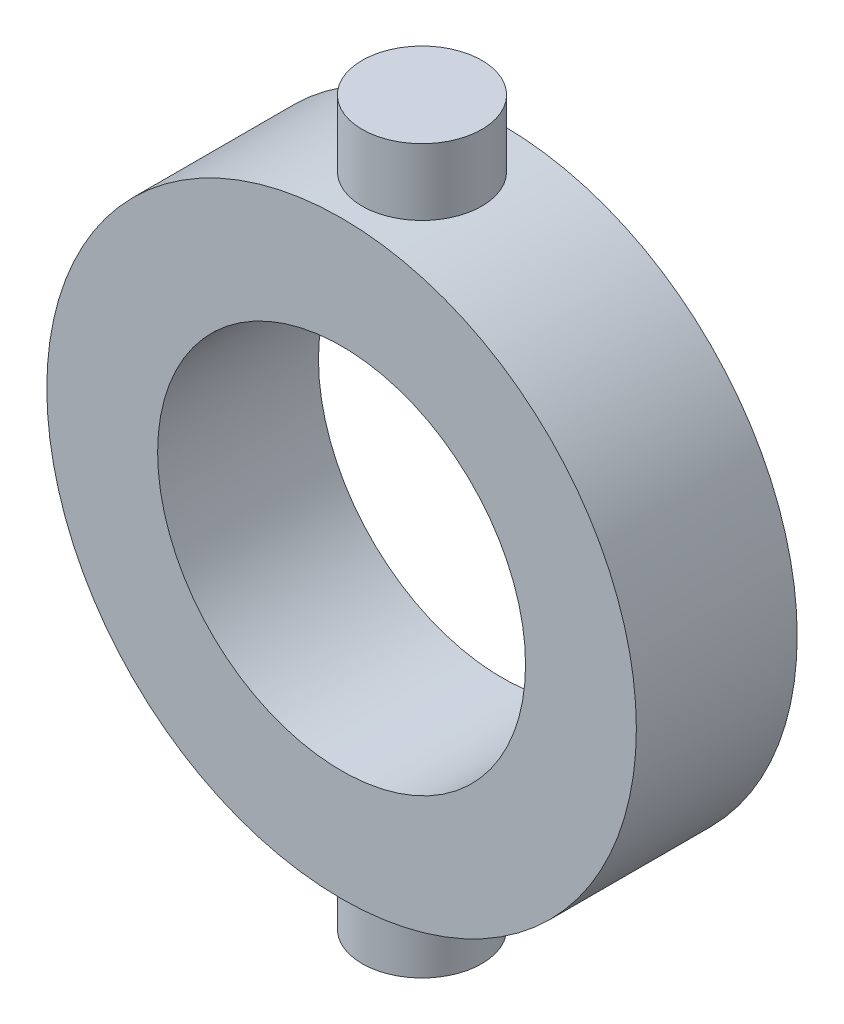
ISO-10303-21;
HEADER;
FILE_DESCRIPTION(('STEP AP214'),'2;1');
FILE_NAME('part.step','',(''),(''),'','','');
FILE_SCHEMA(('AUTOMOTIVE_DESIGN { 1 0 10303 214 1 1 1 1 }'));
ENDSEC;
DATA;
#1=APPLICATION_CONTEXT('core data for automotive mechanical design processes');
#2=APPLICATION_PROTOCOL_DEFINITION('international standard','automotive_design',2000,#1);
#3=PRODUCT_CONTEXT('',#1,'mechanical');
#4=PRODUCT('Part','Part','',(#3));
#5=PRODUCT_RELATED_PRODUCT_CATEGORY('part','',(#4));
#6=PRODUCT_DEFINITION_FORMATION('','',#4);
#7=PRODUCT_DEFINITION_CONTEXT('part definition',#1,'design');
#8=PRODUCT_DEFINITION('design','',#6,#7);
#9=PRODUCT_DEFINITION_SHAPE('','',#8);
#10=(LENGTH_UNIT() NAMED_UNIT(*) SI_UNIT(.MILLI.,.METRE.));
#11=(NAMED_UNIT(*) PLANE_ANGLE_UNIT() SI_UNIT($,.RADIAN.));
#12=(NAMED_UNIT(*) SI_UNIT($,.STERADIAN.) SOLID_ANGLE_UNIT());
#13=UNCERTAINTY_MEASURE_WITH_UNIT(LENGTH_MEASURE(1.E-05),#10,'distance_accuracy_value','');
#14=(GEOMETRIC_REPRESENTATION_CONTEXT(3) GLOBAL_UNCERTAINTY_ASSIGNED_CONTEXT((#13)) GLOBAL_UNIT_ASSIGNED_CONTEXT((#10,
#11,#12)) REPRESENTATION_CONTEXT('',''));
#15=CARTESIAN_POINT('',(0.,0.,0.));
#16=DIRECTION('',(0.,0.,1.));
#17=DIRECTION('',(1.,0.,0.));
#18=AXIS2_PLACEMENT_3D('',#15,#16,#17);
#19=CARTESIAN_POINT('',(0.,-81.5,0.));
#20=DIRECTION('',(0.,1.,0.));
#21=DIRECTION('',(0.,0.,1.));
#22=AXIS2_PLACEMENT_3D('',#19,#20,#21);
#23=CYLINDRICAL_SURFACE('',#22,13.5);
#24=CARTESIAN_POINT('',(0.,-81.5,0.));
#25=DIRECTION('',(0.,1.,0.));
#26=DIRECTION('',(0.,0.,1.));
#27=AXIS2_PLACEMENT_3D('',#24,#25,#26);
#28=CIRCLE('',#27,13.5);
#29=CARTESIAN_POINT('',(0.,-81.5,13.5));
#30=VERTEX_POINT('',#29);
#31=EDGE_CURVE('E11',#30,#30,#28,.T.);
#32=ORIENTED_EDGE('',*,*,#31,.T.);
#33=EDGE_LOOP('',(#32));
#34=FACE_BOUND('',#33,.T.);
#35=CARTESIAN_POINT('',(0.,-66.5,0.));
#36=DIRECTION('',(0.,1.,0.));
#37=DIRECTION('',(0.,0.,1.));
#38=AXIS2_PLACEMENT_3D('',#35,#36,#37);
#39=CIRCLE('',#38,13.5);
#40=CARTESIAN_POINT('',(0.,-66.5,13.5));
#41=VERTEX_POINT('',#40);
#42=EDGE_CURVE('E54',#41,#41,#39,.T.);
#43=ORIENTED_EDGE('',*,*,#42,.F.);
#44=EDGE_LOOP('',(#43));
#45=FACE_BOUND('',#44,.T.);
#46=ADVANCED_FACE('F51',(#34,#45),#23,.T.);
#47=CARTESIAN_POINT('',(0.,-81.5,0.));
#48=DIRECTION('',(0.,1.,0.));
#49=DIRECTION('',(0.,0.,1.));
#50=AXIS2_PLACEMENT_3D('',#47,#48,#49);
#51=PLANE('',#50);
#52=ORIENTED_EDGE('',*,*,#31,.F.);
#53=EDGE_LOOP('',(#52));
#54=FACE_BOUND('',#53,.T.);
#55=ADVANCED_FACE('F66',(#54),#51,.F.);
#56=CARTESIAN_POINT('',(0.,-66.5,0.));
#57=DIRECTION('',(0.,1.,0.));
#58=DIRECTION('',(0.,0.,1.));
#59=AXIS2_PLACEMENT_3D('',#56,#57,#58);
#60=PLANE('',#59);
#61=ORIENTED_EDGE('',*,*,#42,.T.);
#62=EDGE_LOOP('',(#61));
#63=FACE_BOUND('',#62,.T.);
#64=ADVANCED_FACE('F63',(#63),#60,.T.);
#65=CLOSED_SHELL('',(#46,#55,#64));
#66=MANIFOLD_SOLID_BREP('B2',#65);
#67=CARTESIAN_POINT('',(0.,81.5,0.));
#68=DIRECTION('',(0.,-1.,0.));
#69=DIRECTION('',(0.,0.,-1.));
#70=AXIS2_PLACEMENT_3D('',#67,#68,#69);
#71=CYLINDRICAL_SURFACE('',#70,13.5);
#72=CARTESIAN_POINT('',(0.,81.5,0.));
#73=DIRECTION('',(0.,1.,0.));
#74=DIRECTION('',(0.,0.,1.));
#75=AXIS2_PLACEMENT_3D('',#72,#73,#74);
#76=CIRCLE('',#75,13.5);
#77=CARTESIAN_POINT('',(0.,81.5,13.5));
#78=VERTEX_POINT('',#77);
#79=EDGE_CURVE('E50',#78,#78,#76,.T.);
#80=ORIENTED_EDGE('',*,*,#79,.F.);
#81=EDGE_LOOP('',(#80));
#82=FACE_BOUND('',#81,.T.);
#83=CARTESIAN_POINT('',(0.,66.5,0.));
#84=DIRECTION('',(0.,1.,0.));
#85=DIRECTION('',(0.,0.,1.));
#86=AXIS2_PLACEMENT_3D('',#83,#84,#85);
#87=CIRCLE('',#86,13.5);
#88=CARTESIAN_POINT('',(0.,66.5,13.5));
#89=VERTEX_POINT('',#88);
#90=EDGE_CURVE('E101',#89,#89,#87,.T.);
#91=ORIENTED_EDGE('',*,*,#90,.T.);
#92=EDGE_LOOP('',(#91));
#93=FACE_BOUND('',#92,.T.);
#94=ADVANCED_FACE('F98',(#82,#93),#71,.T.);
#95=CARTESIAN_POINT('',(0.,81.5,0.));
#96=DIRECTION('',(0.,1.,0.));
#97=DIRECTION('',(0.,0.,1.));
#98=AXIS2_PLACEMENT_3D('',#95,#96,#97);
#99=PLANE('',#98);
#100=ORIENTED_EDGE('',*,*,#79,.T.);
#101=EDGE_LOOP('',(#100));
#102=FACE_BOUND('',#101,.T.);
#103=ADVANCED_FACE('F113',(#102),#99,.T.);
#104=CARTESIAN_POINT('',(0.,66.5,0.));
#105=DIRECTION('',(0.,1.,0.));
#106=DIRECTION('',(0.,0.,1.));
#107=AXIS2_PLACEMENT_3D('',#104,#105,#106);
#108=PLANE('',#107);
#109=ORIENTED_EDGE('',*,*,#90,.F.);
#110=EDGE_LOOP('',(#109));
#111=FACE_BOUND('',#110,.T.);
#112=ADVANCED_FACE('F111',(#111),#108,.F.);
#113=CLOSED_SHELL('',(#94,#103,#112));
#114=MANIFOLD_SOLID_BREP('B6',#113);
#115=CARTESIAN_POINT('',(0.,0.,0.));
#116=DIRECTION('',(0.,0.,1.));
#117=DIRECTION('',(1.,0.,0.));
#118=AXIS2_PLACEMENT_3D('',#115,#116,#117);
#119=CYLINDRICAL_SURFACE('',#118,41.5);
#120=CARTESIAN_POINT('',(0.,0.,-18.1407185628742));
#121=DIRECTION('',(0.,0.,1.));
#122=DIRECTION('',(1.,0.,0.));
#123=AXIS2_PLACEMENT_3D('',#120,#121,#122);
#124=CIRCLE('',#123,41.5);
#125=CARTESIAN_POINT('',(41.5,0.,-18.1407185628742));
#126=VERTEX_POINT('',#125);
#127=EDGE_CURVE('E155',#126,#126,#124,.T.);
#128=ORIENTED_EDGE('',*,*,#127,.F.);
#129=EDGE_LOOP('',(#128));
#130=FACE_BOUND('',#129,.T.);
#131=CARTESIAN_POINT('',(0.,0.,18.1407185628742));
#132=DIRECTION('',(0.,0.,1.));
#133=DIRECTION('',(1.,0.,0.));
#134=AXIS2_PLACEMENT_3D('',#131,#132,#133);
#135=CIRCLE('',#134,41.5);
#136=CARTESIAN_POINT('',(41.5,0.,18.1407185628742));
#137=VERTEX_POINT('',#136);
#138=EDGE_CURVE('E97',#137,#137,#135,.T.);
#139=ORIENTED_EDGE('',*,*,#138,.T.);
#140=EDGE_LOOP('',(#139));
#141=FACE_BOUND('',#140,.T.);
#142=ADVANCED_FACE('F138',(#130,#141),#119,.F.);
#143=CARTESIAN_POINT('',(-66.5,0.,18.1407185628742));
#144=DIRECTION('',(0.,0.,-1.));
#145=DIRECTION('',(-1.,0.,0.));
#146=AXIS2_PLACEMENT_3D('',#143,#144,#145);
#147=PLANE('',#146);
#148=ORIENTED_EDGE('',*,*,#138,.F.);
#149=EDGE_LOOP('',(#148));
#150=FACE_BOUND('',#149,.T.);
#151=CARTESIAN_POINT('',(0.,0.,18.1407185628742));
#152=DIRECTION('',(0.,0.,1.));
#153=DIRECTION('',(1.,0.,0.));
#154=AXIS2_PLACEMENT_3D('',#151,#152,#153);
#155=CIRCLE('',#154,66.5);
#156=CARTESIAN_POINT('',(66.5,0.,18.1407185628742));
#157=VERTEX_POINT('',#156);
#158=EDGE_CURVE('E145',#157,#157,#155,.T.);
#159=ORIENTED_EDGE('',*,*,#158,.T.);
#160=EDGE_LOOP('',(#159));
#161=FACE_BOUND('',#160,.T.);
#162=ADVANCED_FACE('F165',(#150,#161),#147,.F.);
#163=CARTESIAN_POINT('',(0.,0.,0.));
#164=DIRECTION('',(0.,0.,1.));
#165=DIRECTION('',(1.,0.,0.));
#166=AXIS2_PLACEMENT_3D('',#163,#164,#165);
#167=CYLINDRICAL_SURFACE('',#166,66.5);
#168=ORIENTED_EDGE('',*,*,#158,.F.);
#169=EDGE_LOOP('',(#168));
#170=FACE_BOUND('',#169,.T.);
#171=CARTESIAN_POINT('',(0.,0.,-18.1407185628742));
#172=DIRECTION('',(0.,0.,1.));
#173=DIRECTION('',(1.,0.,0.));
#174=AXIS2_PLACEMENT_3D('',#171,#172,#173);
#175=CIRCLE('',#174,66.5);
#176=CARTESIAN_POINT('',(66.5,0.,-18.1407185628742));
#177=VERTEX_POINT('',#176);
#178=EDGE_CURVE('E150',#177,#177,#175,.T.);
#179=ORIENTED_EDGE('',*,*,#178,.T.);
#180=EDGE_LOOP('',(#179));
#181=FACE_BOUND('',#180,.T.);
#182=ADVANCED_FACE('F169',(#170,#181),#167,.T.);
#183=CARTESIAN_POINT('',(-66.5,0.,-18.1407185628742));
#184=DIRECTION('',(0.,0.,1.));
#185=DIRECTION('',(1.,0.,0.));
#186=AXIS2_PLACEMENT_3D('',#183,#184,#185);
#187=PLANE('',#186);
#188=ORIENTED_EDGE('',*,*,#178,.F.);
#189=EDGE_LOOP('',(#188));
#190=FACE_BOUND('',#189,.T.);
#191=ORIENTED_EDGE('',*,*,#127,.T.);
#192=EDGE_LOOP('',(#191));
#193=FACE_BOUND('',#192,.T.);
#194=ADVANCED_FACE('F162',(#190,#193),#187,.F.);
#195=CLOSED_SHELL('',(#142,#162,#182,#194));
#196=MANIFOLD_SOLID_BREP('B45',#195);
#197=ADVANCED_BREP_SHAPE_REPRESENTATION('',(#18,#66,#114,#196),#14);
#198=SHAPE_DEFINITION_REPRESENTATION(#9,#197);
ENDSEC;
END-ISO-10303-21;
